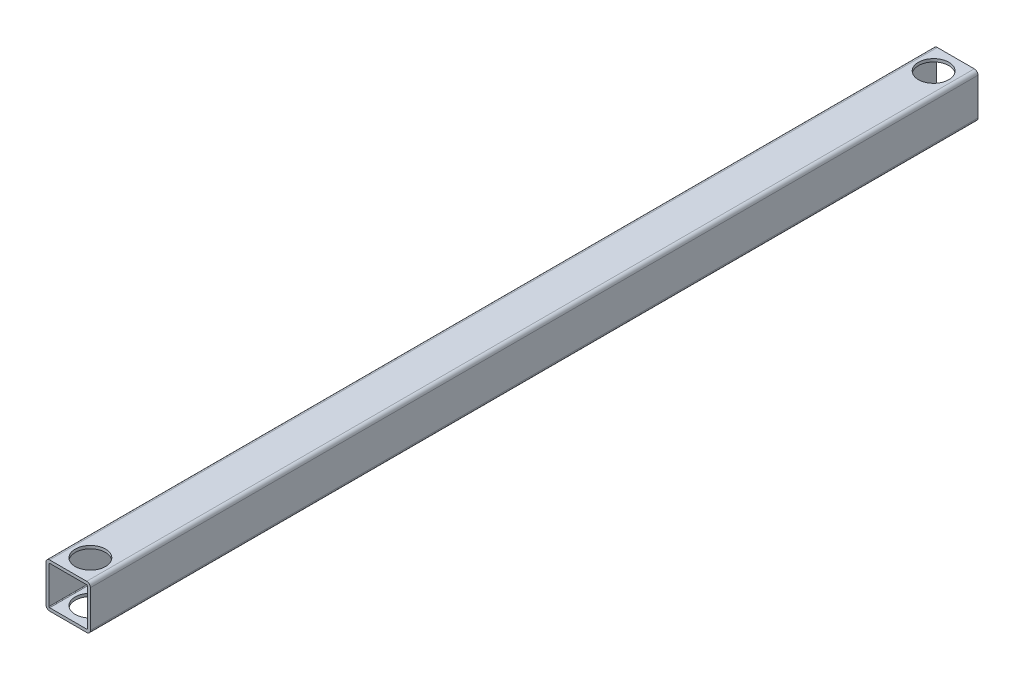
ISO-10303-21;
HEADER;
FILE_DESCRIPTION(('STEP AP214'),'2;1');
FILE_NAME('part.step','',(''),(''),'','','');
FILE_SCHEMA(('AUTOMOTIVE_DESIGN { 1 0 10303 214 1 1 1 1 }'));
ENDSEC;
DATA;
#1=APPLICATION_CONTEXT('core data for automotive mechanical design processes');
#2=APPLICATION_PROTOCOL_DEFINITION('international standard','automotive_design',2000,#1);
#3=PRODUCT_CONTEXT('',#1,'mechanical');
#4=PRODUCT('Part','Part','',(#3));
#5=PRODUCT_RELATED_PRODUCT_CATEGORY('part','',(#4));
#6=PRODUCT_DEFINITION_FORMATION('','',#4);
#7=PRODUCT_DEFINITION_CONTEXT('part definition',#1,'design');
#8=PRODUCT_DEFINITION('design','',#6,#7);
#9=PRODUCT_DEFINITION_SHAPE('','',#8);
#10=(LENGTH_UNIT() NAMED_UNIT(*) SI_UNIT(.MILLI.,.METRE.));
#11=(NAMED_UNIT(*) PLANE_ANGLE_UNIT() SI_UNIT($,.RADIAN.));
#12=(NAMED_UNIT(*) SI_UNIT($,.STERADIAN.) SOLID_ANGLE_UNIT());
#13=UNCERTAINTY_MEASURE_WITH_UNIT(LENGTH_MEASURE(1.E-05),#10,'distance_accuracy_value','');
#14=(GEOMETRIC_REPRESENTATION_CONTEXT(3) GLOBAL_UNCERTAINTY_ASSIGNED_CONTEXT((#13)) GLOBAL_UNIT_ASSIGNED_CONTEXT((#10,
#11,#12)) REPRESENTATION_CONTEXT('',''));
#15=CARTESIAN_POINT('',(0.,0.,0.));
#16=DIRECTION('',(0.,0.,1.));
#17=DIRECTION('',(1.,0.,0.));
#18=AXIS2_PLACEMENT_3D('',#15,#16,#17);
#19=CARTESIAN_POINT('',(0.,15.,285.));
#20=DIRECTION('',(0.,-1.,0.));
#21=DIRECTION('',(1.,0.,0.));
#22=AXIS2_PLACEMENT_3D('',#19,#20,#21);
#23=CYLINDRICAL_SURFACE('',#22,10.25);
#24=CARTESIAN_POINT('',(0.,-13.,285.));
#25=DIRECTION('',(0.,-1.,0.));
#26=DIRECTION('',(1.,0.,0.));
#27=AXIS2_PLACEMENT_3D('',#24,#25,#26);
#28=CIRCLE('',#27,10.25);
#29=CARTESIAN_POINT('',(10.25,-13.,285.));
#30=VERTEX_POINT('',#29);
#31=EDGE_CURVE('E192',#30,#30,#28,.T.);
#32=ORIENTED_EDGE('',*,*,#31,.F.);
#33=EDGE_LOOP('',(#32));
#34=FACE_BOUND('',#33,.T.);
#35=CARTESIAN_POINT('',(0.,-15.,285.));
#36=DIRECTION('',(0.,-1.,0.));
#37=DIRECTION('',(1.,0.,0.));
#38=AXIS2_PLACEMENT_3D('',#35,#36,#37);
#39=CIRCLE('',#38,10.25);
#40=CARTESIAN_POINT('',(10.25,-15.,285.));
#41=VERTEX_POINT('',#40);
#42=EDGE_CURVE('E204',#41,#41,#39,.T.);
#43=ORIENTED_EDGE('',*,*,#42,.T.);
#44=EDGE_LOOP('',(#43));
#45=FACE_BOUND('',#44,.T.);
#46=ADVANCED_FACE('F16',(#34,#45),#23,.F.);
#47=CARTESIAN_POINT('',(0.,15.,-285.));
#48=DIRECTION('',(0.,-1.,0.));
#49=DIRECTION('',(1.,0.,0.));
#50=AXIS2_PLACEMENT_3D('',#47,#48,#49);
#51=CYLINDRICAL_SURFACE('',#50,10.25);
#52=CARTESIAN_POINT('',(0.,-13.,-285.));
#53=DIRECTION('',(0.,-1.,0.));
#54=DIRECTION('',(1.,0.,0.));
#55=AXIS2_PLACEMENT_3D('',#52,#53,#54);
#56=CIRCLE('',#55,10.25);
#57=CARTESIAN_POINT('',(10.25,-13.,-285.));
#58=VERTEX_POINT('',#57);
#59=EDGE_CURVE('E143',#58,#58,#56,.T.);
#60=ORIENTED_EDGE('',*,*,#59,.F.);
#61=EDGE_LOOP('',(#60));
#62=FACE_BOUND('',#61,.T.);
#63=CARTESIAN_POINT('',(0.,-15.,-285.));
#64=DIRECTION('',(0.,-1.,0.));
#65=DIRECTION('',(1.,0.,0.));
#66=AXIS2_PLACEMENT_3D('',#63,#64,#65);
#67=CIRCLE('',#66,10.25);
#68=CARTESIAN_POINT('',(10.25,-15.,-285.));
#69=VERTEX_POINT('',#68);
#70=EDGE_CURVE('E194',#69,#69,#67,.T.);
#71=ORIENTED_EDGE('',*,*,#70,.T.);
#72=EDGE_LOOP('',(#71));
#73=FACE_BOUND('',#72,.T.);
#74=ADVANCED_FACE('F313',(#62,#73),#51,.F.);
#75=CARTESIAN_POINT('',(-12.5,-12.5,300.));
#76=DIRECTION('',(0.,0.,-1.));
#77=DIRECTION('',(-1.,0.,0.));
#78=AXIS2_PLACEMENT_3D('',#75,#76,#77);
#79=CYLINDRICAL_SURFACE('',#78,0.499999999999995);
#80=DIRECTION('',(0.,0.,-1.));
#81=VECTOR('',#80,1.);
#82=CARTESIAN_POINT('',(-13.,-12.5,300.));
#83=LINE('',#82,#81);
#84=CARTESIAN_POINT('',(-13.,-12.5,300.));
#85=VERTEX_POINT('',#84);
#86=CARTESIAN_POINT('',(-13.,-12.5,-300.));
#87=VERTEX_POINT('',#86);
#88=EDGE_CURVE('E128',#85,#87,#83,.T.);
#89=ORIENTED_EDGE('',*,*,#88,.F.);
#90=CARTESIAN_POINT('',(-12.5,-12.5,300.));
#91=DIRECTION('',(0.,0.,-1.));
#92=DIRECTION('',(-1.,0.,0.));
#93=AXIS2_PLACEMENT_3D('',#90,#91,#92);
#94=CIRCLE('',#93,0.499999999999995);
#95=CARTESIAN_POINT('',(-12.5,-13.,300.));
#96=VERTEX_POINT('',#95);
#97=EDGE_CURVE('E19',#96,#85,#94,.T.);
#98=ORIENTED_EDGE('',*,*,#97,.F.);
#99=DIRECTION('',(0.,0.,1.));
#100=VECTOR('',#99,1.);
#101=CARTESIAN_POINT('',(-12.5,-13.,300.));
#102=LINE('',#101,#100);
#103=CARTESIAN_POINT('',(-12.5,-13.,-300.));
#104=VERTEX_POINT('',#103);
#105=EDGE_CURVE('E125',#104,#96,#102,.T.);
#106=ORIENTED_EDGE('',*,*,#105,.F.);
#107=CARTESIAN_POINT('',(-12.5,-12.5,-300.));
#108=DIRECTION('',(0.,0.,-1.));
#109=DIRECTION('',(-1.,0.,0.));
#110=AXIS2_PLACEMENT_3D('',#107,#108,#109);
#111=CIRCLE('',#110,0.499999999999995);
#112=EDGE_CURVE('E133',#87,#104,#111,.F.);
#113=ORIENTED_EDGE('',*,*,#112,.F.);
#114=EDGE_LOOP('',(#89,#98,#106,#113));
#115=FACE_BOUND('',#114,.T.);
#116=ADVANCED_FACE('F124',(#115),#79,.F.);
#117=CARTESIAN_POINT('',(12.5,-12.5,300.));
#118=DIRECTION('',(0.,0.,-1.));
#119=DIRECTION('',(-1.,0.,0.));
#120=AXIS2_PLACEMENT_3D('',#117,#118,#119);
#121=CYLINDRICAL_SURFACE('',#120,0.499999999999999);
#122=DIRECTION('',(0.,0.,1.));
#123=VECTOR('',#122,1.);
#124=CARTESIAN_POINT('',(12.5,-13.,300.));
#125=LINE('',#124,#123);
#126=CARTESIAN_POINT('',(12.5,-13.,300.));
#127=VERTEX_POINT('',#126);
#128=CARTESIAN_POINT('',(12.5,-13.,-300.));
#129=VERTEX_POINT('',#128);
#130=EDGE_CURVE('E142',#127,#129,#125,.F.);
#131=ORIENTED_EDGE('',*,*,#130,.F.);
#132=CARTESIAN_POINT('',(12.5,-12.5,300.));
#133=DIRECTION('',(0.,0.,-1.));
#134=DIRECTION('',(-1.,0.,0.));
#135=AXIS2_PLACEMENT_3D('',#132,#133,#134);
#136=CIRCLE('',#135,0.499999999999999);
#137=CARTESIAN_POINT('',(13.,-12.5,300.));
#138=VERTEX_POINT('',#137);
#139=EDGE_CURVE('E148',#138,#127,#136,.T.);
#140=ORIENTED_EDGE('',*,*,#139,.F.);
#141=DIRECTION('',(0.,0.,1.));
#142=VECTOR('',#141,1.);
#143=CARTESIAN_POINT('',(13.,-12.5,300.));
#144=LINE('',#143,#142);
#145=CARTESIAN_POINT('',(13.,-12.5,-300.));
#146=VERTEX_POINT('',#145);
#147=EDGE_CURVE('E179',#146,#138,#144,.T.);
#148=ORIENTED_EDGE('',*,*,#147,.F.);
#149=CARTESIAN_POINT('',(12.5,-12.5,-300.));
#150=DIRECTION('',(0.,0.,-1.));
#151=DIRECTION('',(-1.,0.,0.));
#152=AXIS2_PLACEMENT_3D('',#149,#150,#151);
#153=CIRCLE('',#152,0.499999999999999);
#154=EDGE_CURVE('E252',#129,#146,#153,.F.);
#155=ORIENTED_EDGE('',*,*,#154,.F.);
#156=EDGE_LOOP('',(#131,#140,#148,#155));
#157=FACE_BOUND('',#156,.T.);
#158=ADVANCED_FACE('F301',(#157),#121,.F.);
#159=CARTESIAN_POINT('',(0.,15.,285.));
#160=DIRECTION('',(0.,-1.,0.));
#161=DIRECTION('',(1.,0.,0.));
#162=AXIS2_PLACEMENT_3D('',#159,#160,#161);
#163=CYLINDRICAL_SURFACE('',#162,10.25);
#164=CARTESIAN_POINT('',(0.,13.,285.));
#165=DIRECTION('',(0.,-1.,0.));
#166=DIRECTION('',(1.,0.,0.));
#167=AXIS2_PLACEMENT_3D('',#164,#165,#166);
#168=CIRCLE('',#167,10.25);
#169=CARTESIAN_POINT('',(10.25,13.,285.));
#170=VERTEX_POINT('',#169);
#171=EDGE_CURVE('E184',#170,#170,#168,.F.);
#172=ORIENTED_EDGE('',*,*,#171,.F.);
#173=EDGE_LOOP('',(#172));
#174=FACE_BOUND('',#173,.T.);
#175=CARTESIAN_POINT('',(0.,15.,285.));
#176=DIRECTION('',(0.,-1.,0.));
#177=DIRECTION('',(1.,0.,0.));
#178=AXIS2_PLACEMENT_3D('',#175,#176,#177);
#179=CIRCLE('',#178,10.25);
#180=CARTESIAN_POINT('',(10.25,15.,285.));
#181=VERTEX_POINT('',#180);
#182=EDGE_CURVE('E208',#181,#181,#179,.F.);
#183=ORIENTED_EDGE('',*,*,#182,.T.);
#184=EDGE_LOOP('',(#183));
#185=FACE_BOUND('',#184,.T.);
#186=ADVANCED_FACE('F303',(#174,#185),#163,.F.);
#187=CARTESIAN_POINT('',(0.,15.,-285.));
#188=DIRECTION('',(0.,-1.,0.));
#189=DIRECTION('',(1.,0.,0.));
#190=AXIS2_PLACEMENT_3D('',#187,#188,#189);
#191=CYLINDRICAL_SURFACE('',#190,10.25);
#192=CARTESIAN_POINT('',(0.,13.,-285.));
#193=DIRECTION('',(0.,-1.,0.));
#194=DIRECTION('',(1.,0.,0.));
#195=AXIS2_PLACEMENT_3D('',#192,#193,#194);
#196=CIRCLE('',#195,10.25);
#197=CARTESIAN_POINT('',(10.25,13.,-285.));
#198=VERTEX_POINT('',#197);
#199=EDGE_CURVE('E176',#198,#198,#196,.F.);
#200=ORIENTED_EDGE('',*,*,#199,.F.);
#201=EDGE_LOOP('',(#200));
#202=FACE_BOUND('',#201,.T.);
#203=CARTESIAN_POINT('',(0.,15.,-285.));
#204=DIRECTION('',(0.,-1.,0.));
#205=DIRECTION('',(1.,0.,0.));
#206=AXIS2_PLACEMENT_3D('',#203,#204,#205);
#207=CIRCLE('',#206,10.25);
#208=CARTESIAN_POINT('',(10.25,15.,-285.));
#209=VERTEX_POINT('',#208);
#210=EDGE_CURVE('E205',#209,#209,#207,.F.);
#211=ORIENTED_EDGE('',*,*,#210,.T.);
#212=EDGE_LOOP('',(#211));
#213=FACE_BOUND('',#212,.T.);
#214=ADVANCED_FACE('F310',(#202,#213),#191,.F.);
#215=CARTESIAN_POINT('',(12.5,12.5,300.));
#216=DIRECTION('',(0.,0.,-1.));
#217=DIRECTION('',(-1.,0.,0.));
#218=AXIS2_PLACEMENT_3D('',#215,#216,#217);
#219=CYLINDRICAL_SURFACE('',#218,0.499999999999999);
#220=DIRECTION('',(0.,0.,1.));
#221=VECTOR('',#220,1.);
#222=CARTESIAN_POINT('',(13.,12.5,300.));
#223=LINE('',#222,#221);
#224=CARTESIAN_POINT('',(13.,12.5,300.));
#225=VERTEX_POINT('',#224);
#226=CARTESIAN_POINT('',(13.,12.5,-300.));
#227=VERTEX_POINT('',#226);
#228=EDGE_CURVE('E182',#225,#227,#223,.F.);
#229=ORIENTED_EDGE('',*,*,#228,.F.);
#230=CARTESIAN_POINT('',(12.5,12.5,300.));
#231=DIRECTION('',(0.,0.,-1.));
#232=DIRECTION('',(-1.,0.,0.));
#233=AXIS2_PLACEMENT_3D('',#230,#231,#232);
#234=CIRCLE('',#233,0.499999999999999);
#235=CARTESIAN_POINT('',(12.5,13.,300.));
#236=VERTEX_POINT('',#235);
#237=EDGE_CURVE('E250',#236,#225,#234,.T.);
#238=ORIENTED_EDGE('',*,*,#237,.F.);
#239=DIRECTION('',(0.,0.,1.));
#240=VECTOR('',#239,1.);
#241=CARTESIAN_POINT('',(12.5,13.,300.));
#242=LINE('',#241,#240);
#243=CARTESIAN_POINT('',(12.5,13.,-300.));
#244=VERTEX_POINT('',#243);
#245=EDGE_CURVE('E172',#244,#236,#242,.T.);
#246=ORIENTED_EDGE('',*,*,#245,.F.);
#247=CARTESIAN_POINT('',(12.5,12.5,-300.));
#248=DIRECTION('',(0.,0.,-1.));
#249=DIRECTION('',(-1.,0.,0.));
#250=AXIS2_PLACEMENT_3D('',#247,#248,#249);
#251=CIRCLE('',#250,0.499999999999999);
#252=EDGE_CURVE('E248',#227,#244,#251,.F.);
#253=ORIENTED_EDGE('',*,*,#252,.F.);
#254=EDGE_LOOP('',(#229,#238,#246,#253));
#255=FACE_BOUND('',#254,.T.);
#256=ADVANCED_FACE('F295',(#255),#219,.F.);
#257=CARTESIAN_POINT('',(-12.5,12.5,300.));
#258=DIRECTION('',(0.,0.,-1.));
#259=DIRECTION('',(-1.,0.,0.));
#260=AXIS2_PLACEMENT_3D('',#257,#258,#259);
#261=CYLINDRICAL_SURFACE('',#260,0.499999999999995);
#262=DIRECTION('',(0.,0.,1.));
#263=VECTOR('',#262,1.);
#264=CARTESIAN_POINT('',(-12.5,13.,300.));
#265=LINE('',#264,#263);
#266=CARTESIAN_POINT('',(-12.5,13.,300.));
#267=VERTEX_POINT('',#266);
#268=CARTESIAN_POINT('',(-12.5,13.,-300.));
#269=VERTEX_POINT('',#268);
#270=EDGE_CURVE('E175',#267,#269,#265,.F.);
#271=ORIENTED_EDGE('',*,*,#270,.F.);
#272=CARTESIAN_POINT('',(-12.5,12.5,300.));
#273=DIRECTION('',(0.,0.,-1.));
#274=DIRECTION('',(-1.,0.,0.));
#275=AXIS2_PLACEMENT_3D('',#272,#273,#274);
#276=CIRCLE('',#275,0.499999999999995);
#277=CARTESIAN_POINT('',(-13.,12.5,300.));
#278=VERTEX_POINT('',#277);
#279=EDGE_CURVE('E246',#278,#267,#276,.T.);
#280=ORIENTED_EDGE('',*,*,#279,.F.);
#281=DIRECTION('',(0.,0.,-1.));
#282=VECTOR('',#281,1.);
#283=CARTESIAN_POINT('',(-13.,12.5,300.));
#284=LINE('',#283,#282);
#285=CARTESIAN_POINT('',(-13.,12.5,-300.));
#286=VERTEX_POINT('',#285);
#287=EDGE_CURVE('E187',#286,#278,#284,.F.);
#288=ORIENTED_EDGE('',*,*,#287,.F.);
#289=CARTESIAN_POINT('',(-12.5,12.5,-300.));
#290=DIRECTION('',(0.,0.,-1.));
#291=DIRECTION('',(-1.,0.,0.));
#292=AXIS2_PLACEMENT_3D('',#289,#290,#291);
#293=CIRCLE('',#292,0.499999999999995);
#294=EDGE_CURVE('E212',#269,#286,#293,.F.);
#295=ORIENTED_EDGE('',*,*,#294,.F.);
#296=EDGE_LOOP('',(#271,#280,#288,#295));
#297=FACE_BOUND('',#296,.T.);
#298=ADVANCED_FACE('F292',(#297),#261,.F.);
#299=CARTESIAN_POINT('',(-12.5,-12.5,300.));
#300=DIRECTION('',(0.,0.,-1.));
#301=DIRECTION('',(-1.,0.,0.));
#302=AXIS2_PLACEMENT_3D('',#299,#300,#301);
#303=CYLINDRICAL_SURFACE('',#302,2.5);
#304=CARTESIAN_POINT('',(-12.5,-12.5,300.));
#305=DIRECTION('',(0.,0.,-1.));
#306=DIRECTION('',(-1.,0.,0.));
#307=AXIS2_PLACEMENT_3D('',#304,#305,#306);
#308=CIRCLE('',#307,2.5);
#309=CARTESIAN_POINT('',(-12.5,-15.,300.));
#310=VERTEX_POINT('',#309);
#311=CARTESIAN_POINT('',(-15.,-12.5,300.));
#312=VERTEX_POINT('',#311);
#313=EDGE_CURVE('E151',#310,#312,#308,.T.);
#314=ORIENTED_EDGE('',*,*,#313,.T.);
#315=DIRECTION('',(0.,0.,-1.));
#316=VECTOR('',#315,1.);
#317=CARTESIAN_POINT('',(-15.,-12.5,300.));
#318=LINE('',#317,#316);
#319=CARTESIAN_POINT('',(-15.,-12.5,-300.));
#320=VERTEX_POINT('',#319);
#321=EDGE_CURVE('E209',#312,#320,#318,.T.);
#322=ORIENTED_EDGE('',*,*,#321,.T.);
#323=CARTESIAN_POINT('',(-12.5,-12.5,-300.));
#324=DIRECTION('',(0.,0.,-1.));
#325=DIRECTION('',(-1.,0.,0.));
#326=AXIS2_PLACEMENT_3D('',#323,#324,#325);
#327=CIRCLE('',#326,2.5);
#328=CARTESIAN_POINT('',(-12.5,-15.,-300.));
#329=VERTEX_POINT('',#328);
#330=EDGE_CURVE('E222',#329,#320,#327,.T.);
#331=ORIENTED_EDGE('',*,*,#330,.F.);
#332=DIRECTION('',(0.,0.,1.));
#333=VECTOR('',#332,1.);
#334=CARTESIAN_POINT('',(-12.5,-15.,300.));
#335=LINE('',#334,#333);
#336=EDGE_CURVE('E190',#329,#310,#335,.T.);
#337=ORIENTED_EDGE('',*,*,#336,.T.);
#338=EDGE_LOOP('',(#314,#322,#331,#337));
#339=FACE_BOUND('',#338,.T.);
#340=ADVANCED_FACE('F358',(#339),#303,.T.);
#341=CARTESIAN_POINT('',(-15.,-12.5,300.));
#342=DIRECTION('',(1.,0.,0.));
#343=DIRECTION('',(0.,0.,-1.));
#344=AXIS2_PLACEMENT_3D('',#341,#342,#343);
#345=PLANE('',#344);
#346=ORIENTED_EDGE('',*,*,#321,.F.);
#347=DIRECTION('',(0.,1.,0.));
#348=VECTOR('',#347,1.);
#349=CARTESIAN_POINT('',(-15.,-12.5,300.));
#350=LINE('',#349,#348);
#351=CARTESIAN_POINT('',(-15.,12.5,300.));
#352=VERTEX_POINT('',#351);
#353=EDGE_CURVE('E168',#312,#352,#350,.T.);
#354=ORIENTED_EDGE('',*,*,#353,.T.);
#355=DIRECTION('',(0.,0.,-1.));
#356=VECTOR('',#355,1.);
#357=CARTESIAN_POINT('',(-15.,12.5,300.));
#358=LINE('',#357,#356);
#359=CARTESIAN_POINT('',(-15.,12.5,-300.));
#360=VERTEX_POINT('',#359);
#361=EDGE_CURVE('E206',#360,#352,#358,.F.);
#362=ORIENTED_EDGE('',*,*,#361,.F.);
#363=DIRECTION('',(0.,1.,0.));
#364=VECTOR('',#363,1.);
#365=CARTESIAN_POINT('',(-15.,-12.5,-300.));
#366=LINE('',#365,#364);
#367=EDGE_CURVE('E221',#320,#360,#366,.T.);
#368=ORIENTED_EDGE('',*,*,#367,.F.);
#369=EDGE_LOOP('',(#346,#354,#362,#368));
#370=FACE_BOUND('',#369,.T.);
#371=ADVANCED_FACE('F354',(#370),#345,.F.);
#372=CARTESIAN_POINT('',(-12.5,12.5,300.));
#373=DIRECTION('',(0.,0.,-1.));
#374=DIRECTION('',(-1.,0.,0.));
#375=AXIS2_PLACEMENT_3D('',#372,#373,#374);
#376=CYLINDRICAL_SURFACE('',#375,2.5);
#377=CARTESIAN_POINT('',(-12.5,12.5,300.));
#378=DIRECTION('',(0.,0.,-1.));
#379=DIRECTION('',(-1.,0.,0.));
#380=AXIS2_PLACEMENT_3D('',#377,#378,#379);
#381=CIRCLE('',#380,2.5);
#382=CARTESIAN_POINT('',(-12.5,15.,300.));
#383=VERTEX_POINT('',#382);
#384=EDGE_CURVE('E167',#352,#383,#381,.T.);
#385=ORIENTED_EDGE('',*,*,#384,.T.);
#386=DIRECTION('',(0.,0.,1.));
#387=VECTOR('',#386,1.);
#388=CARTESIAN_POINT('',(-12.5,15.,300.));
#389=LINE('',#388,#387);
#390=CARTESIAN_POINT('',(-12.5,15.,-300.));
#391=VERTEX_POINT('',#390);
#392=EDGE_CURVE('E201',#383,#391,#389,.F.);
#393=ORIENTED_EDGE('',*,*,#392,.T.);
#394=CARTESIAN_POINT('',(-12.5,12.5,-300.));
#395=DIRECTION('',(0.,0.,-1.));
#396=DIRECTION('',(-1.,0.,0.));
#397=AXIS2_PLACEMENT_3D('',#394,#395,#396);
#398=CIRCLE('',#397,2.5);
#399=EDGE_CURVE('E219',#360,#391,#398,.T.);
#400=ORIENTED_EDGE('',*,*,#399,.F.);
#401=ORIENTED_EDGE('',*,*,#361,.T.);
#402=EDGE_LOOP('',(#385,#393,#400,#401));
#403=FACE_BOUND('',#402,.T.);
#404=ADVANCED_FACE('F350',(#403),#376,.T.);
#405=CARTESIAN_POINT('',(-12.5,15.,300.));
#406=DIRECTION('',(0.,-1.,0.));
#407=DIRECTION('',(1.,0.,0.));
#408=AXIS2_PLACEMENT_3D('',#405,#406,#407);
#409=PLANE('',#408);
#410=ORIENTED_EDGE('',*,*,#392,.F.);
#411=DIRECTION('',(-1.,0.,0.));
#412=VECTOR('',#411,1.);
#413=CARTESIAN_POINT('',(-12.5,15.,300.));
#414=LINE('',#413,#412);
#415=CARTESIAN_POINT('',(12.5,15.,300.));
#416=VERTEX_POINT('',#415);
#417=EDGE_CURVE('E164',#383,#416,#414,.F.);
#418=ORIENTED_EDGE('',*,*,#417,.T.);
#419=DIRECTION('',(0.,0.,-1.));
#420=VECTOR('',#419,1.);
#421=CARTESIAN_POINT('',(12.5,15.,300.));
#422=LINE('',#421,#420);
#423=CARTESIAN_POINT('',(12.5,15.,-300.));
#424=VERTEX_POINT('',#423);
#425=EDGE_CURVE('E197',#424,#416,#422,.F.);
#426=ORIENTED_EDGE('',*,*,#425,.F.);
#427=DIRECTION('',(-1.,0.,0.));
#428=VECTOR('',#427,1.);
#429=CARTESIAN_POINT('',(-12.5,15.,-300.));
#430=LINE('',#429,#428);
#431=EDGE_CURVE('E218',#391,#424,#430,.F.);
#432=ORIENTED_EDGE('',*,*,#431,.F.);
#433=EDGE_LOOP('',(#410,#418,#426,#432));
#434=FACE_BOUND('',#433,.T.);
#435=ORIENTED_EDGE('',*,*,#210,.F.);
#436=EDGE_LOOP('',(#435));
#437=FACE_BOUND('',#436,.T.);
#438=ORIENTED_EDGE('',*,*,#182,.F.);
#439=EDGE_LOOP('',(#438));
#440=FACE_BOUND('',#439,.T.);
#441=ADVANCED_FACE('F346',(#434,#437,#440),#409,.F.);
#442=CARTESIAN_POINT('',(-12.5,-15.,300.));
#443=DIRECTION('',(0.,1.,0.));
#444=DIRECTION('',(-1.,0.,0.));
#445=AXIS2_PLACEMENT_3D('',#442,#443,#444);
#446=PLANE('',#445);
#447=DIRECTION('',(0.,0.,-1.));
#448=VECTOR('',#447,1.);
#449=CARTESIAN_POINT('',(12.5,-15.,300.));
#450=LINE('',#449,#448);
#451=CARTESIAN_POINT('',(12.5,-15.,300.));
#452=VERTEX_POINT('',#451);
#453=CARTESIAN_POINT('',(12.5,-15.,-300.));
#454=VERTEX_POINT('',#453);
#455=EDGE_CURVE('E171',#452,#454,#450,.T.);
#456=ORIENTED_EDGE('',*,*,#455,.F.);
#457=DIRECTION('',(-1.,0.,0.));
#458=VECTOR('',#457,1.);
#459=CARTESIAN_POINT('',(-12.5,-15.,300.));
#460=LINE('',#459,#458);
#461=EDGE_CURVE('E157',#452,#310,#460,.T.);
#462=ORIENTED_EDGE('',*,*,#461,.T.);
#463=ORIENTED_EDGE('',*,*,#336,.F.);
#464=DIRECTION('',(-1.,0.,0.));
#465=VECTOR('',#464,1.);
#466=CARTESIAN_POINT('',(-12.5,-15.,-300.));
#467=LINE('',#466,#465);
#468=EDGE_CURVE('E216',#454,#329,#467,.T.);
#469=ORIENTED_EDGE('',*,*,#468,.F.);
#470=EDGE_LOOP('',(#456,#462,#463,#469));
#471=FACE_BOUND('',#470,.T.);
#472=ORIENTED_EDGE('',*,*,#70,.F.);
#473=EDGE_LOOP('',(#472));
#474=FACE_BOUND('',#473,.T.);
#475=ORIENTED_EDGE('',*,*,#42,.F.);
#476=EDGE_LOOP('',(#475));
#477=FACE_BOUND('',#476,.T.);
#478=ADVANCED_FACE('F343',(#471,#474,#477),#446,.F.);
#479=CARTESIAN_POINT('',(-13.,-12.5,300.));
#480=DIRECTION('',(1.,0.,0.));
#481=DIRECTION('',(0.,0.,-1.));
#482=AXIS2_PLACEMENT_3D('',#479,#480,#481);
#483=PLANE('',#482);
#484=DIRECTION('',(0.,1.,0.));
#485=VECTOR('',#484,1.);
#486=CARTESIAN_POINT('',(-13.,-12.5,300.));
#487=LINE('',#486,#485);
#488=EDGE_CURVE('E200',#278,#85,#487,.F.);
#489=ORIENTED_EDGE('',*,*,#488,.T.);
#490=ORIENTED_EDGE('',*,*,#88,.T.);
#491=DIRECTION('',(0.,1.,0.));
#492=VECTOR('',#491,1.);
#493=CARTESIAN_POINT('',(-13.,-12.5,-300.));
#494=LINE('',#493,#492);
#495=EDGE_CURVE('E259',#286,#87,#494,.F.);
#496=ORIENTED_EDGE('',*,*,#495,.F.);
#497=ORIENTED_EDGE('',*,*,#287,.T.);
#498=EDGE_LOOP('',(#489,#490,#496,#497));
#499=FACE_BOUND('',#498,.T.);
#500=ADVANCED_FACE('F261',(#499),#483,.T.);
#501=CARTESIAN_POINT('',(-12.5,-13.,300.));
#502=DIRECTION('',(0.,1.,0.));
#503=DIRECTION('',(-1.,0.,0.));
#504=AXIS2_PLACEMENT_3D('',#501,#502,#503);
#505=PLANE('',#504);
#506=DIRECTION('',(-1.,0.,0.));
#507=VECTOR('',#506,1.);
#508=CARTESIAN_POINT('',(-12.5,-13.,300.));
#509=LINE('',#508,#507);
#510=EDGE_CURVE('E139',#96,#127,#509,.F.);
#511=ORIENTED_EDGE('',*,*,#510,.T.);
#512=ORIENTED_EDGE('',*,*,#130,.T.);
#513=DIRECTION('',(-1.,0.,0.));
#514=VECTOR('',#513,1.);
#515=CARTESIAN_POINT('',(-12.5,-13.,-300.));
#516=LINE('',#515,#514);
#517=EDGE_CURVE('E141',#104,#129,#516,.F.);
#518=ORIENTED_EDGE('',*,*,#517,.F.);
#519=ORIENTED_EDGE('',*,*,#105,.T.);
#520=EDGE_LOOP('',(#511,#512,#518,#519));
#521=FACE_BOUND('',#520,.T.);
#522=ORIENTED_EDGE('',*,*,#59,.T.);
#523=EDGE_LOOP('',(#522));
#524=FACE_BOUND('',#523,.T.);
#525=ORIENTED_EDGE('',*,*,#31,.T.);
#526=EDGE_LOOP('',(#525));
#527=FACE_BOUND('',#526,.T.);
#528=ADVANCED_FACE('F136',(#521,#524,#527),#505,.T.);
#529=CARTESIAN_POINT('',(13.,-12.5,300.));
#530=DIRECTION('',(-1.,0.,0.));
#531=DIRECTION('',(0.,0.,1.));
#532=AXIS2_PLACEMENT_3D('',#529,#530,#531);
#533=PLANE('',#532);
#534=DIRECTION('',(0.,1.,0.));
#535=VECTOR('',#534,1.);
#536=CARTESIAN_POINT('',(13.,-12.5,300.));
#537=LINE('',#536,#535);
#538=EDGE_CURVE('E150',#138,#225,#537,.T.);
#539=ORIENTED_EDGE('',*,*,#538,.T.);
#540=ORIENTED_EDGE('',*,*,#228,.T.);
#541=DIRECTION('',(0.,1.,0.));
#542=VECTOR('',#541,1.);
#543=CARTESIAN_POINT('',(13.,-12.5,-300.));
#544=LINE('',#543,#542);
#545=EDGE_CURVE('E281',#146,#227,#544,.T.);
#546=ORIENTED_EDGE('',*,*,#545,.F.);
#547=ORIENTED_EDGE('',*,*,#147,.T.);
#548=EDGE_LOOP('',(#539,#540,#546,#547));
#549=FACE_BOUND('',#548,.T.);
#550=ADVANCED_FACE('F298',(#549),#533,.T.);
#551=CARTESIAN_POINT('',(-12.5,13.,300.));
#552=DIRECTION('',(0.,-1.,0.));
#553=DIRECTION('',(1.,0.,0.));
#554=AXIS2_PLACEMENT_3D('',#551,#552,#553);
#555=PLANE('',#554);
#556=DIRECTION('',(-1.,0.,0.));
#557=VECTOR('',#556,1.);
#558=CARTESIAN_POINT('',(-12.5,13.,300.));
#559=LINE('',#558,#557);
#560=EDGE_CURVE('E154',#236,#267,#559,.T.);
#561=ORIENTED_EDGE('',*,*,#560,.T.);
#562=ORIENTED_EDGE('',*,*,#270,.T.);
#563=DIRECTION('',(-1.,0.,0.));
#564=VECTOR('',#563,1.);
#565=CARTESIAN_POINT('',(-12.5,13.,-300.));
#566=LINE('',#565,#564);
#567=EDGE_CURVE('E271',#244,#269,#566,.T.);
#568=ORIENTED_EDGE('',*,*,#567,.F.);
#569=ORIENTED_EDGE('',*,*,#245,.T.);
#570=EDGE_LOOP('',(#561,#562,#568,#569));
#571=FACE_BOUND('',#570,.T.);
#572=ORIENTED_EDGE('',*,*,#199,.T.);
#573=EDGE_LOOP('',(#572));
#574=FACE_BOUND('',#573,.T.);
#575=ORIENTED_EDGE('',*,*,#171,.T.);
#576=EDGE_LOOP('',(#575));
#577=FACE_BOUND('',#576,.T.);
#578=ADVANCED_FACE('F287',(#571,#574,#577),#555,.T.);
#579=CARTESIAN_POINT('',(12.5,-12.5,300.));
#580=DIRECTION('',(0.,0.,-1.));
#581=DIRECTION('',(-1.,0.,0.));
#582=AXIS2_PLACEMENT_3D('',#579,#580,#581);
#583=CYLINDRICAL_SURFACE('',#582,2.50000000000001);
#584=CARTESIAN_POINT('',(12.5,-12.5,300.));
#585=DIRECTION('',(0.,0.,-1.));
#586=DIRECTION('',(-1.,0.,0.));
#587=AXIS2_PLACEMENT_3D('',#584,#585,#586);
#588=CIRCLE('',#587,2.50000000000001);
#589=CARTESIAN_POINT('',(15.,-12.5,300.));
#590=VERTEX_POINT('',#589);
#591=EDGE_CURVE('E163',#590,#452,#588,.T.);
#592=ORIENTED_EDGE('',*,*,#591,.T.);
#593=ORIENTED_EDGE('',*,*,#455,.T.);
#594=CARTESIAN_POINT('',(12.5,-12.5,-300.));
#595=DIRECTION('',(0.,0.,-1.));
#596=DIRECTION('',(-1.,0.,0.));
#597=AXIS2_PLACEMENT_3D('',#594,#595,#596);
#598=CIRCLE('',#597,2.50000000000001);
#599=CARTESIAN_POINT('',(15.,-12.5,-300.));
#600=VERTEX_POINT('',#599);
#601=EDGE_CURVE('E213',#600,#454,#598,.T.);
#602=ORIENTED_EDGE('',*,*,#601,.F.);
#603=DIRECTION('',(0.,0.,1.));
#604=VECTOR('',#603,1.);
#605=CARTESIAN_POINT('',(15.,-12.5,300.));
#606=LINE('',#605,#604);
#607=EDGE_CURVE('E269',#600,#590,#606,.T.);
#608=ORIENTED_EDGE('',*,*,#607,.T.);
#609=EDGE_LOOP('',(#592,#593,#602,#608));
#610=FACE_BOUND('',#609,.T.);
#611=ADVANCED_FACE('F331',(#610),#583,.T.);
#612=CARTESIAN_POINT('',(-12.5,-12.5,300.));
#613=DIRECTION('',(0.,0.,-1.));
#614=DIRECTION('',(-1.,0.,0.));
#615=AXIS2_PLACEMENT_3D('',#612,#613,#614);
#616=PLANE('',#615);
#617=ORIENTED_EDGE('',*,*,#488,.F.);
#618=ORIENTED_EDGE('',*,*,#279,.T.);
#619=ORIENTED_EDGE('',*,*,#560,.F.);
#620=ORIENTED_EDGE('',*,*,#237,.T.);
#621=ORIENTED_EDGE('',*,*,#538,.F.);
#622=ORIENTED_EDGE('',*,*,#139,.T.);
#623=ORIENTED_EDGE('',*,*,#510,.F.);
#624=ORIENTED_EDGE('',*,*,#97,.T.);
#625=EDGE_LOOP('',(#617,#618,#619,#620,#621,#622,#623,#624));
#626=FACE_BOUND('',#625,.T.);
#627=ORIENTED_EDGE('',*,*,#461,.F.);
#628=ORIENTED_EDGE('',*,*,#591,.F.);
#629=DIRECTION('',(0.,-1.,0.));
#630=VECTOR('',#629,1.);
#631=CARTESIAN_POINT('',(15.,-12.5,300.));
#632=LINE('',#631,#630);
#633=CARTESIAN_POINT('',(15.,12.5,300.));
#634=VERTEX_POINT('',#633);
#635=EDGE_CURVE('E266',#590,#634,#632,.F.);
#636=ORIENTED_EDGE('',*,*,#635,.T.);
#637=CARTESIAN_POINT('',(12.5,12.5,300.));
#638=DIRECTION('',(0.,0.,-1.));
#639=DIRECTION('',(-1.,0.,0.));
#640=AXIS2_PLACEMENT_3D('',#637,#638,#639);
#641=CIRCLE('',#640,2.5);
#642=EDGE_CURVE('E199',#416,#634,#641,.T.);
#643=ORIENTED_EDGE('',*,*,#642,.F.);
#644=ORIENTED_EDGE('',*,*,#417,.F.);
#645=ORIENTED_EDGE('',*,*,#384,.F.);
#646=ORIENTED_EDGE('',*,*,#353,.F.);
#647=ORIENTED_EDGE('',*,*,#313,.F.);
#648=EDGE_LOOP('',(#627,#628,#636,#643,#644,#645,#646,#647));
#649=FACE_BOUND('',#648,.T.);
#650=ADVANCED_FACE('F145',(#626,#649),#616,.F.);
#651=CARTESIAN_POINT('',(12.5,12.5,300.));
#652=DIRECTION('',(0.,0.,-1.));
#653=DIRECTION('',(-1.,0.,0.));
#654=AXIS2_PLACEMENT_3D('',#651,#652,#653);
#655=CYLINDRICAL_SURFACE('',#654,2.5);
#656=ORIENTED_EDGE('',*,*,#642,.T.);
#657=DIRECTION('',(0.,0.,1.));
#658=VECTOR('',#657,1.);
#659=CARTESIAN_POINT('',(15.,12.5,300.));
#660=LINE('',#659,#658);
#661=CARTESIAN_POINT('',(15.,12.5,-300.));
#662=VERTEX_POINT('',#661);
#663=EDGE_CURVE('E25',#634,#662,#660,.F.);
#664=ORIENTED_EDGE('',*,*,#663,.T.);
#665=CARTESIAN_POINT('',(12.5,12.5,-300.));
#666=DIRECTION('',(0.,0.,-1.));
#667=DIRECTION('',(-1.,0.,0.));
#668=AXIS2_PLACEMENT_3D('',#665,#666,#667);
#669=CIRCLE('',#668,2.5);
#670=EDGE_CURVE('E33',#424,#662,#669,.T.);
#671=ORIENTED_EDGE('',*,*,#670,.F.);
#672=ORIENTED_EDGE('',*,*,#425,.T.);
#673=EDGE_LOOP('',(#656,#664,#671,#672));
#674=FACE_BOUND('',#673,.T.);
#675=ADVANCED_FACE('F322',(#674),#655,.T.);
#676=CARTESIAN_POINT('',(-12.5,-12.5,-300.));
#677=DIRECTION('',(0.,0.,-1.));
#678=DIRECTION('',(-1.,0.,0.));
#679=AXIS2_PLACEMENT_3D('',#676,#677,#678);
#680=PLANE('',#679);
#681=ORIENTED_EDGE('',*,*,#567,.T.);
#682=ORIENTED_EDGE('',*,*,#294,.T.);
#683=ORIENTED_EDGE('',*,*,#495,.T.);
#684=ORIENTED_EDGE('',*,*,#112,.T.);
#685=ORIENTED_EDGE('',*,*,#517,.T.);
#686=ORIENTED_EDGE('',*,*,#154,.T.);
#687=ORIENTED_EDGE('',*,*,#545,.T.);
#688=ORIENTED_EDGE('',*,*,#252,.T.);
#689=EDGE_LOOP('',(#681,#682,#683,#684,#685,#686,#687,#688));
#690=FACE_BOUND('',#689,.T.);
#691=ORIENTED_EDGE('',*,*,#601,.T.);
#692=ORIENTED_EDGE('',*,*,#468,.T.);
#693=ORIENTED_EDGE('',*,*,#330,.T.);
#694=ORIENTED_EDGE('',*,*,#367,.T.);
#695=ORIENTED_EDGE('',*,*,#399,.T.);
#696=ORIENTED_EDGE('',*,*,#431,.T.);
#697=ORIENTED_EDGE('',*,*,#670,.T.);
#698=DIRECTION('',(0.,-1.,0.));
#699=VECTOR('',#698,1.);
#700=CARTESIAN_POINT('',(15.,-12.5,-300.));
#701=LINE('',#700,#699);
#702=EDGE_CURVE('E11',#662,#600,#701,.T.);
#703=ORIENTED_EDGE('',*,*,#702,.T.);
#704=EDGE_LOOP('',(#691,#692,#693,#694,#695,#696,#697,#703));
#705=FACE_BOUND('',#704,.T.);
#706=ADVANCED_FACE('F257',(#690,#705),#680,.T.);
#707=CARTESIAN_POINT('',(15.,-12.5,300.));
#708=DIRECTION('',(-1.,0.,0.));
#709=DIRECTION('',(0.,-1.,0.));
#710=AXIS2_PLACEMENT_3D('',#707,#708,#709);
#711=PLANE('',#710);
#712=ORIENTED_EDGE('',*,*,#663,.F.);
#713=ORIENTED_EDGE('',*,*,#635,.F.);
#714=ORIENTED_EDGE('',*,*,#607,.F.);
#715=ORIENTED_EDGE('',*,*,#702,.F.);
#716=EDGE_LOOP('',(#712,#713,#714,#715));
#717=FACE_BOUND('',#716,.T.);
#718=ADVANCED_FACE('F315',(#717),#711,.F.);
#719=CLOSED_SHELL('',(#46,#74,#116,#158,#186,#214,#256,#298,#340,#371,#404,#441,#478,#500,#528,
#550,#578,#611,#650,#675,#706,#718));
#720=MANIFOLD_SOLID_BREP('B1',#719);
#721=ADVANCED_BREP_SHAPE_REPRESENTATION('',(#18,#720),#14);
#722=SHAPE_DEFINITION_REPRESENTATION(#9,#721);
ENDSEC;
END-ISO-10303-21;
